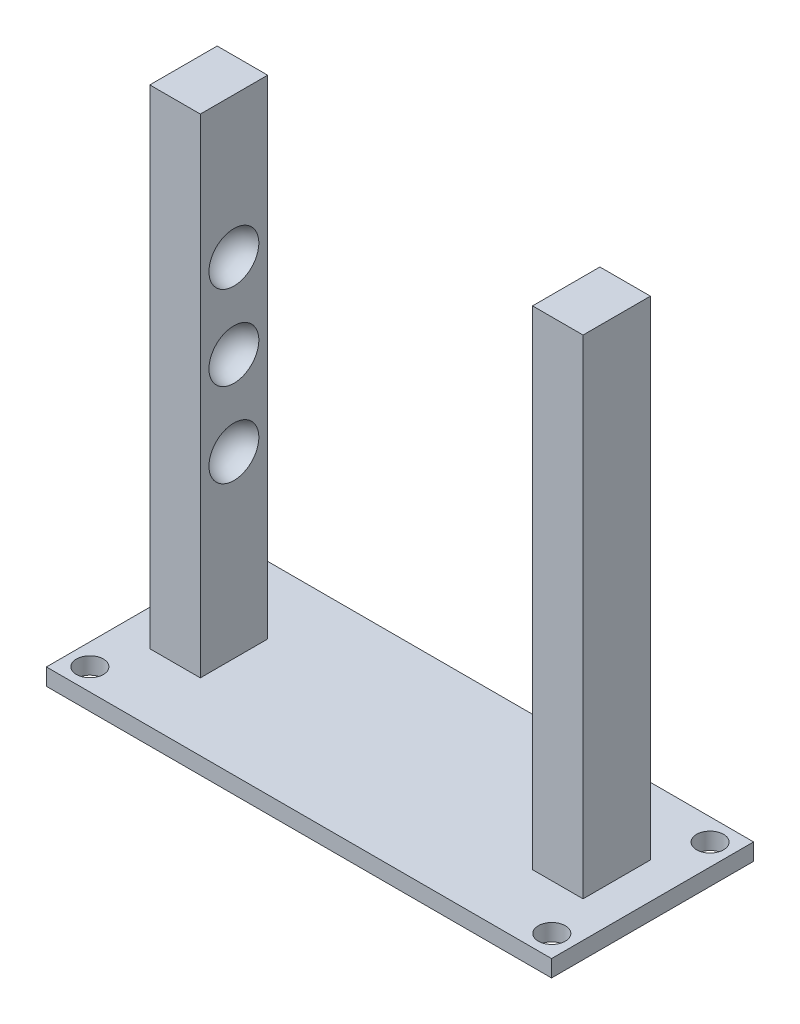
ISO-10303-21;
HEADER;
FILE_DESCRIPTION(('STEP AP214'),'2;1');
FILE_NAME('part.step','',(''),(''),'','','');
FILE_SCHEMA(('AUTOMOTIVE_DESIGN { 1 0 10303 214 1 1 1 1 }'));
ENDSEC;
DATA;
#1=APPLICATION_CONTEXT('core data for automotive mechanical design processes');
#2=APPLICATION_PROTOCOL_DEFINITION('international standard','automotive_design',2000,#1);
#3=PRODUCT_CONTEXT('',#1,'mechanical');
#4=PRODUCT('Part','Part','',(#3));
#5=PRODUCT_RELATED_PRODUCT_CATEGORY('part','',(#4));
#6=PRODUCT_DEFINITION_FORMATION('','',#4);
#7=PRODUCT_DEFINITION_CONTEXT('part definition',#1,'design');
#8=PRODUCT_DEFINITION('design','',#6,#7);
#9=PRODUCT_DEFINITION_SHAPE('','',#8);
#10=(LENGTH_UNIT() NAMED_UNIT(*) SI_UNIT(.MILLI.,.METRE.));
#11=(NAMED_UNIT(*) PLANE_ANGLE_UNIT() SI_UNIT($,.RADIAN.));
#12=(NAMED_UNIT(*) SI_UNIT($,.STERADIAN.) SOLID_ANGLE_UNIT());
#13=UNCERTAINTY_MEASURE_WITH_UNIT(LENGTH_MEASURE(1.E-05),#10,'distance_accuracy_value','');
#14=(GEOMETRIC_REPRESENTATION_CONTEXT(3) GLOBAL_UNCERTAINTY_ASSIGNED_CONTEXT((#13)) GLOBAL_UNIT_ASSIGNED_CONTEXT((#10,
#11,#12)) REPRESENTATION_CONTEXT('',''));
#15=CARTESIAN_POINT('',(0.,0.,0.));
#16=DIRECTION('',(0.,0.,1.));
#17=DIRECTION('',(1.,0.,0.));
#18=AXIS2_PLACEMENT_3D('',#15,#16,#17);
#19=CARTESIAN_POINT('',(0.,5.,0.));
#20=DIRECTION('',(0.,1.,0.));
#21=DIRECTION('',(0.,0.,1.));
#22=AXIS2_PLACEMENT_3D('',#19,#20,#21);
#23=PLANE('',#22);
#24=DIRECTION('',(0.,0.,-1.));
#25=VECTOR('',#24,1.);
#26=CARTESIAN_POINT('',(23.8497549812934,5.,0.));
#27=LINE('',#26,#25);
#28=CARTESIAN_POINT('',(23.8497549812934,5.,-0.572361891268997));
#29=VERTEX_POINT('',#28);
#30=CARTESIAN_POINT('',(23.8497549812934,5.,-20.572361891269));
#31=VERTEX_POINT('',#30);
#32=EDGE_CURVE('E140',#29,#31,#27,.T.);
#33=ORIENTED_EDGE('',*,*,#32,.F.);
#34=DIRECTION('',(1.,0.,0.));
#35=VECTOR('',#34,1.);
#36=CARTESIAN_POINT('',(0.,5.,-0.572361891268997));
#37=LINE('',#36,#35);
#38=CARTESIAN_POINT('',(8.84975498129335,5.,-0.572361891268997));
#39=VERTEX_POINT('',#38);
#40=EDGE_CURVE('E143',#39,#29,#37,.T.);
#41=ORIENTED_EDGE('',*,*,#40,.F.);
#42=DIRECTION('',(0.,0.,1.));
#43=VECTOR('',#42,1.);
#44=CARTESIAN_POINT('',(8.84975498129335,5.,0.));
#45=LINE('',#44,#43);
#46=CARTESIAN_POINT('',(8.84975498129335,5.,-20.572361891269));
#47=VERTEX_POINT('',#46);
#48=EDGE_CURVE('E67',#47,#39,#45,.T.);
#49=ORIENTED_EDGE('',*,*,#48,.F.);
#50=DIRECTION('',(-1.,0.,0.));
#51=VECTOR('',#50,1.);
#52=CARTESIAN_POINT('',(0.,5.,-20.572361891269));
#53=LINE('',#52,#51);
#54=EDGE_CURVE('E62',#31,#47,#53,.T.);
#55=ORIENTED_EDGE('',*,*,#54,.F.);
#56=EDGE_LOOP('',(#33,#41,#49,#55));
#57=FACE_BOUND('',#56,.T.);
#58=CARTESIAN_POINT('',(28.1101283683343,5.,-34.038808084481));
#59=DIRECTION('',(0.,-1.,0.));
#60=DIRECTION('',(0.,0.,1.));
#61=AXIS2_PLACEMENT_3D('',#58,#59,#60);
#62=CIRCLE('',#61,4.00000000000001);
#63=CARTESIAN_POINT('',(28.1101283683343,5.,-30.038808084481));
#64=VERTEX_POINT('',#63);
#65=EDGE_CURVE('E175',#64,#64,#62,.T.);
#66=ORIENTED_EDGE('',*,*,#65,.T.);
#67=EDGE_LOOP('',(#66));
#68=FACE_BOUND('',#67,.T.);
#69=CARTESIAN_POINT('',(28.1101283683343,5.,12.961191915519));
#70=DIRECTION('',(0.,1.,0.));
#71=DIRECTION('',(0.,0.,-1.));
#72=AXIS2_PLACEMENT_3D('',#69,#70,#71);
#73=CIRCLE('',#72,4.00000000000001);
#74=CARTESIAN_POINT('',(28.1101283683343,5.,8.96119191551903));
#75=VERTEX_POINT('',#74);
#76=EDGE_CURVE('E181',#75,#75,#73,.T.);
#77=ORIENTED_EDGE('',*,*,#76,.F.);
#78=EDGE_LOOP('',(#77));
#79=FACE_BOUND('',#78,.T.);
#80=CARTESIAN_POINT('',(-109.062885818753,5.,12.961191915519));
#81=DIRECTION('',(0.,-1.,0.));
#82=DIRECTION('',(0.,0.,-1.));
#83=AXIS2_PLACEMENT_3D('',#80,#81,#82);
#84=CIRCLE('',#83,4.00000000000001);
#85=CARTESIAN_POINT('',(-109.062885818753,5.,8.96119191551903));
#86=VERTEX_POINT('',#85);
#87=EDGE_CURVE('E187',#86,#86,#84,.T.);
#88=ORIENTED_EDGE('',*,*,#87,.T.);
#89=EDGE_LOOP('',(#88));
#90=FACE_BOUND('',#89,.T.);
#91=CARTESIAN_POINT('',(-109.062885818753,5.,-34.038808084481));
#92=DIRECTION('',(0.,1.,0.));
#93=DIRECTION('',(0.,0.,1.));
#94=AXIS2_PLACEMENT_3D('',#91,#92,#93);
#95=CIRCLE('',#94,4.00000000000001);
#96=CARTESIAN_POINT('',(-109.062885818753,5.,-30.038808084481));
#97=VERTEX_POINT('',#96);
#98=EDGE_CURVE('E193',#97,#97,#95,.T.);
#99=ORIENTED_EDGE('',*,*,#98,.F.);
#100=EDGE_LOOP('',(#99));
#101=FACE_BOUND('',#100,.T.);
#102=DIRECTION('',(0.,0.,1.));
#103=VECTOR('',#102,1.);
#104=CARTESIAN_POINT('',(-115.476378725209,5.,-40.538808084481));
#105=LINE('',#104,#103);
#106=CARTESIAN_POINT('',(-115.476378725209,5.,-40.538808084481));
#107=VERTEX_POINT('',#106);
#108=CARTESIAN_POINT('',(-115.476378725209,5.,19.461191915519));
#109=VERTEX_POINT('',#108);
#110=EDGE_CURVE('E233',#107,#109,#105,.T.);
#111=ORIENTED_EDGE('',*,*,#110,.T.);
#112=DIRECTION('',(1.,0.,0.));
#113=VECTOR('',#112,1.);
#114=CARTESIAN_POINT('',(-115.476378725209,5.,19.461191915519));
#115=LINE('',#114,#113);
#116=CARTESIAN_POINT('',(34.5236212747906,5.,19.461191915519));
#117=VERTEX_POINT('',#116);
#118=EDGE_CURVE('E236',#109,#117,#115,.T.);
#119=ORIENTED_EDGE('',*,*,#118,.T.);
#120=DIRECTION('',(0.,0.,-1.));
#121=VECTOR('',#120,1.);
#122=CARTESIAN_POINT('',(34.5236212747906,5.,-40.538808084481));
#123=LINE('',#122,#121);
#124=CARTESIAN_POINT('',(34.5236212747906,5.,-40.538808084481));
#125=VERTEX_POINT('',#124);
#126=EDGE_CURVE('E239',#117,#125,#123,.T.);
#127=ORIENTED_EDGE('',*,*,#126,.T.);
#128=DIRECTION('',(-1.,0.,0.));
#129=VECTOR('',#128,1.);
#130=CARTESIAN_POINT('',(-115.476378725209,5.,-40.538808084481));
#131=LINE('',#130,#129);
#132=EDGE_CURVE('E241',#125,#107,#131,.T.);
#133=ORIENTED_EDGE('',*,*,#132,.T.);
#134=EDGE_LOOP('',(#111,#119,#127,#133));
#135=FACE_BOUND('',#134,.T.);
#136=DIRECTION('',(-1.,0.,0.));
#137=VECTOR('',#136,1.);
#138=CARTESIAN_POINT('',(0.,5.,-0.572361891268997));
#139=LINE('',#138,#137);
#140=CARTESIAN_POINT('',(-89.8025124317122,5.,-0.572361891268997));
#141=VERTEX_POINT('',#140);
#142=CARTESIAN_POINT('',(-104.802512431712,5.,-0.572361891268997));
#143=VERTEX_POINT('',#142);
#144=EDGE_CURVE('E226',#141,#143,#139,.T.);
#145=ORIENTED_EDGE('',*,*,#144,.T.);
#146=DIRECTION('',(0.,0.,-1.));
#147=VECTOR('',#146,1.);
#148=CARTESIAN_POINT('',(-104.802512431712,5.,0.));
#149=LINE('',#148,#147);
#150=CARTESIAN_POINT('',(-104.802512431712,5.,-20.572361891269));
#151=VERTEX_POINT('',#150);
#152=EDGE_CURVE('E229',#143,#151,#149,.T.);
#153=ORIENTED_EDGE('',*,*,#152,.T.);
#154=DIRECTION('',(1.,0.,0.));
#155=VECTOR('',#154,1.);
#156=CARTESIAN_POINT('',(0.,5.,-20.572361891269));
#157=LINE('',#156,#155);
#158=CARTESIAN_POINT('',(-89.8025124317122,5.,-20.572361891269));
#159=VERTEX_POINT('',#158);
#160=EDGE_CURVE('E220',#151,#159,#157,.T.);
#161=ORIENTED_EDGE('',*,*,#160,.T.);
#162=DIRECTION('',(0.,0.,1.));
#163=VECTOR('',#162,1.);
#164=CARTESIAN_POINT('',(-89.8025124317122,5.,0.));
#165=LINE('',#164,#163);
#166=EDGE_CURVE('E223',#159,#141,#165,.T.);
#167=ORIENTED_EDGE('',*,*,#166,.T.);
#168=EDGE_LOOP('',(#145,#153,#161,#167));
#169=FACE_BOUND('',#168,.T.);
#170=ADVANCED_FACE('F45',(#57,#68,#79,#90,#101,#135,#169),#23,.T.);
#171=CARTESIAN_POINT('',(-115.476378725209,5.,-40.538808084481));
#172=DIRECTION('',(1.,0.,0.));
#173=DIRECTION('',(0.,0.,-1.));
#174=AXIS2_PLACEMENT_3D('',#171,#172,#173);
#175=PLANE('',#174);
#176=DIRECTION('',(0.,0.,1.));
#177=VECTOR('',#176,1.);
#178=CARTESIAN_POINT('',(-115.476378725209,0.,-40.538808084481));
#179=LINE('',#178,#177);
#180=CARTESIAN_POINT('',(-115.476378725209,0.,-40.538808084481));
#181=VERTEX_POINT('',#180);
#182=CARTESIAN_POINT('',(-115.476378725209,0.,19.461191915519));
#183=VERTEX_POINT('',#182);
#184=EDGE_CURVE('E232',#181,#183,#179,.T.);
#185=ORIENTED_EDGE('',*,*,#184,.T.);
#186=DIRECTION('',(0.,-1.,0.));
#187=VECTOR('',#186,1.);
#188=CARTESIAN_POINT('',(-115.476378725209,5.,19.461191915519));
#189=LINE('',#188,#187);
#190=EDGE_CURVE('E11',#109,#183,#189,.T.);
#191=ORIENTED_EDGE('',*,*,#190,.F.);
#192=ORIENTED_EDGE('',*,*,#110,.F.);
#193=DIRECTION('',(0.,-1.,0.));
#194=VECTOR('',#193,1.);
#195=CARTESIAN_POINT('',(-115.476378725209,5.,-40.538808084481));
#196=LINE('',#195,#194);
#197=EDGE_CURVE('E243',#107,#181,#196,.T.);
#198=ORIENTED_EDGE('',*,*,#197,.T.);
#199=EDGE_LOOP('',(#185,#191,#192,#198));
#200=FACE_BOUND('',#199,.T.);
#201=ADVANCED_FACE('F47',(#200),#175,.F.);
#202=CARTESIAN_POINT('',(-115.476378725209,5.,19.461191915519));
#203=DIRECTION('',(0.,0.,-1.));
#204=DIRECTION('',(-1.,0.,0.));
#205=AXIS2_PLACEMENT_3D('',#202,#203,#204);
#206=PLANE('',#205);
#207=DIRECTION('',(1.,0.,0.));
#208=VECTOR('',#207,1.);
#209=CARTESIAN_POINT('',(-115.476378725209,0.,19.461191915519));
#210=LINE('',#209,#208);
#211=CARTESIAN_POINT('',(34.5236212747906,0.,19.461191915519));
#212=VERTEX_POINT('',#211);
#213=EDGE_CURVE('E246',#183,#212,#210,.T.);
#214=ORIENTED_EDGE('',*,*,#213,.T.);
#215=DIRECTION('',(0.,-1.,0.));
#216=VECTOR('',#215,1.);
#217=CARTESIAN_POINT('',(34.5236212747906,5.,19.461191915519));
#218=LINE('',#217,#216);
#219=EDGE_CURVE('E54',#117,#212,#218,.T.);
#220=ORIENTED_EDGE('',*,*,#219,.F.);
#221=ORIENTED_EDGE('',*,*,#118,.F.);
#222=ORIENTED_EDGE('',*,*,#190,.T.);
#223=EDGE_LOOP('',(#214,#220,#221,#222));
#224=FACE_BOUND('',#223,.T.);
#225=ADVANCED_FACE('F342',(#224),#206,.F.);
#226=CARTESIAN_POINT('',(34.5236212747906,5.,-40.538808084481));
#227=DIRECTION('',(-1.,0.,0.));
#228=DIRECTION('',(0.,0.,1.));
#229=AXIS2_PLACEMENT_3D('',#226,#227,#228);
#230=PLANE('',#229);
#231=DIRECTION('',(0.,0.,-1.));
#232=VECTOR('',#231,1.);
#233=CARTESIAN_POINT('',(34.5236212747906,0.,-40.538808084481));
#234=LINE('',#233,#232);
#235=CARTESIAN_POINT('',(34.5236212747906,0.,-40.538808084481));
#236=VERTEX_POINT('',#235);
#237=EDGE_CURVE('E248',#212,#236,#234,.T.);
#238=ORIENTED_EDGE('',*,*,#237,.T.);
#239=DIRECTION('',(0.,-1.,0.));
#240=VECTOR('',#239,1.);
#241=CARTESIAN_POINT('',(34.5236212747906,5.,-40.538808084481));
#242=LINE('',#241,#240);
#243=EDGE_CURVE('E253',#125,#236,#242,.T.);
#244=ORIENTED_EDGE('',*,*,#243,.F.);
#245=ORIENTED_EDGE('',*,*,#126,.F.);
#246=ORIENTED_EDGE('',*,*,#219,.T.);
#247=EDGE_LOOP('',(#238,#244,#245,#246));
#248=FACE_BOUND('',#247,.T.);
#249=ADVANCED_FACE('F339',(#248),#230,.F.);
#250=CARTESIAN_POINT('',(-115.476378725209,5.,-40.538808084481));
#251=DIRECTION('',(0.,0.,1.));
#252=DIRECTION('',(1.,0.,0.));
#253=AXIS2_PLACEMENT_3D('',#250,#251,#252);
#254=PLANE('',#253);
#255=DIRECTION('',(-1.,0.,0.));
#256=VECTOR('',#255,1.);
#257=CARTESIAN_POINT('',(-115.476378725209,0.,-40.538808084481));
#258=LINE('',#257,#256);
#259=EDGE_CURVE('E237',#236,#181,#258,.T.);
#260=ORIENTED_EDGE('',*,*,#259,.T.);
#261=ORIENTED_EDGE('',*,*,#197,.F.);
#262=ORIENTED_EDGE('',*,*,#132,.F.);
#263=ORIENTED_EDGE('',*,*,#243,.T.);
#264=EDGE_LOOP('',(#260,#261,#262,#263));
#265=FACE_BOUND('',#264,.T.);
#266=ADVANCED_FACE('F335',(#265),#254,.F.);
#267=CARTESIAN_POINT('',(0.,0.,0.));
#268=DIRECTION('',(0.,1.,0.));
#269=DIRECTION('',(0.,0.,1.));
#270=AXIS2_PLACEMENT_3D('',#267,#268,#269);
#271=PLANE('',#270);
#272=CARTESIAN_POINT('',(28.1101283683343,0.,-34.038808084481));
#273=DIRECTION('',(0.,-1.,0.));
#274=DIRECTION('',(0.,0.,1.));
#275=AXIS2_PLACEMENT_3D('',#272,#273,#274);
#276=CIRCLE('',#275,4.00000000000001);
#277=CARTESIAN_POINT('',(28.1101283683343,0.,-30.038808084481));
#278=VERTEX_POINT('',#277);
#279=EDGE_CURVE('E174',#278,#278,#276,.T.);
#280=ORIENTED_EDGE('',*,*,#279,.F.);
#281=EDGE_LOOP('',(#280));
#282=FACE_BOUND('',#281,.T.);
#283=CARTESIAN_POINT('',(28.1101283683343,0.,12.961191915519));
#284=DIRECTION('',(0.,1.,0.));
#285=DIRECTION('',(0.,0.,-1.));
#286=AXIS2_PLACEMENT_3D('',#283,#284,#285);
#287=CIRCLE('',#286,4.00000000000001);
#288=CARTESIAN_POINT('',(28.1101283683343,0.,8.96119191551903));
#289=VERTEX_POINT('',#288);
#290=EDGE_CURVE('E178',#289,#289,#287,.T.);
#291=ORIENTED_EDGE('',*,*,#290,.T.);
#292=EDGE_LOOP('',(#291));
#293=FACE_BOUND('',#292,.T.);
#294=CARTESIAN_POINT('',(-109.062885818753,0.,12.961191915519));
#295=DIRECTION('',(0.,-1.,0.));
#296=DIRECTION('',(0.,0.,-1.));
#297=AXIS2_PLACEMENT_3D('',#294,#295,#296);
#298=CIRCLE('',#297,4.00000000000001);
#299=CARTESIAN_POINT('',(-109.062885818753,0.,8.96119191551903));
#300=VERTEX_POINT('',#299);
#301=EDGE_CURVE('E184',#300,#300,#298,.T.);
#302=ORIENTED_EDGE('',*,*,#301,.F.);
#303=EDGE_LOOP('',(#302));
#304=FACE_BOUND('',#303,.T.);
#305=CARTESIAN_POINT('',(-109.062885818753,0.,-34.038808084481));
#306=DIRECTION('',(0.,1.,0.));
#307=DIRECTION('',(0.,0.,1.));
#308=AXIS2_PLACEMENT_3D('',#305,#306,#307);
#309=CIRCLE('',#308,4.00000000000001);
#310=CARTESIAN_POINT('',(-109.062885818753,0.,-30.038808084481));
#311=VERTEX_POINT('',#310);
#312=EDGE_CURVE('E190',#311,#311,#309,.T.);
#313=ORIENTED_EDGE('',*,*,#312,.T.);
#314=EDGE_LOOP('',(#313));
#315=FACE_BOUND('',#314,.T.);
#316=ORIENTED_EDGE('',*,*,#184,.F.);
#317=ORIENTED_EDGE('',*,*,#259,.F.);
#318=ORIENTED_EDGE('',*,*,#237,.F.);
#319=ORIENTED_EDGE('',*,*,#213,.F.);
#320=EDGE_LOOP('',(#316,#317,#318,#319));
#321=FACE_BOUND('',#320,.T.);
#322=ADVANCED_FACE('F331',(#282,#293,#304,#315,#321),#271,.F.);
#323=CARTESIAN_POINT('',(-104.802512431712,150.,-20.572361891269));
#324=DIRECTION('',(1.,0.,0.));
#325=DIRECTION('',(0.,0.,-1.));
#326=AXIS2_PLACEMENT_3D('',#323,#324,#325);
#327=PLANE('',#326);
#328=ORIENTED_EDGE('',*,*,#152,.F.);
#329=DIRECTION('',(0.,-1.,0.));
#330=VECTOR('',#329,1.);
#331=CARTESIAN_POINT('',(-104.802512431712,150.,-0.572361891268997));
#332=LINE('',#331,#330);
#333=CARTESIAN_POINT('',(-104.802512431712,150.,-0.572361891268997));
#334=VERTEX_POINT('',#333);
#335=EDGE_CURVE('E217',#334,#143,#332,.T.);
#336=ORIENTED_EDGE('',*,*,#335,.F.);
#337=DIRECTION('',(0.,0.,1.));
#338=VECTOR('',#337,1.);
#339=CARTESIAN_POINT('',(-104.802512431712,150.,-20.572361891269));
#340=LINE('',#339,#338);
#341=CARTESIAN_POINT('',(-104.802512431712,150.,-20.572361891269));
#342=VERTEX_POINT('',#341);
#343=EDGE_CURVE('E199',#342,#334,#340,.T.);
#344=ORIENTED_EDGE('',*,*,#343,.F.);
#345=DIRECTION('',(0.,-1.,0.));
#346=VECTOR('',#345,1.);
#347=CARTESIAN_POINT('',(-104.802512431712,150.,-20.572361891269));
#348=LINE('',#347,#346);
#349=EDGE_CURVE('E209',#342,#151,#348,.T.);
#350=ORIENTED_EDGE('',*,*,#349,.T.);
#351=EDGE_LOOP('',(#328,#336,#344,#350));
#352=FACE_BOUND('',#351,.T.);
#353=ADVANCED_FACE('F313',(#352),#327,.F.);
#354=CARTESIAN_POINT('',(-104.802512431712,150.,-0.572361891268997));
#355=DIRECTION('',(0.,0.,-1.));
#356=DIRECTION('',(-1.,0.,0.));
#357=AXIS2_PLACEMENT_3D('',#354,#355,#356);
#358=PLANE('',#357);
#359=ORIENTED_EDGE('',*,*,#144,.F.);
#360=DIRECTION('',(0.,-1.,0.));
#361=VECTOR('',#360,1.);
#362=CARTESIAN_POINT('',(-89.8025124317122,150.,-0.572361891268997));
#363=LINE('',#362,#361);
#364=CARTESIAN_POINT('',(-89.8025124317122,150.,-0.572361891268997));
#365=VERTEX_POINT('',#364);
#366=EDGE_CURVE('E214',#365,#141,#363,.T.);
#367=ORIENTED_EDGE('',*,*,#366,.F.);
#368=DIRECTION('',(1.,0.,0.));
#369=VECTOR('',#368,1.);
#370=CARTESIAN_POINT('',(-104.802512431712,150.,-0.572361891268997));
#371=LINE('',#370,#369);
#372=EDGE_CURVE('E202',#334,#365,#371,.T.);
#373=ORIENTED_EDGE('',*,*,#372,.F.);
#374=ORIENTED_EDGE('',*,*,#335,.T.);
#375=EDGE_LOOP('',(#359,#367,#373,#374));
#376=FACE_BOUND('',#375,.T.);
#377=ADVANCED_FACE('F301',(#376),#358,.F.);
#378=CARTESIAN_POINT('',(-89.8025124317122,150.,-20.572361891269));
#379=DIRECTION('',(-1.,0.,0.));
#380=DIRECTION('',(0.,0.,1.));
#381=AXIS2_PLACEMENT_3D('',#378,#379,#380);
#382=PLANE('',#381);
#383=CARTESIAN_POINT('',(-89.8025124317122,108.174013099664,-10.538808084481));
#384=DIRECTION('',(-1.,0.,0.));
#385=DIRECTION('',(0.,0.,1.));
#386=AXIS2_PLACEMENT_3D('',#383,#384,#385);
#387=CIRCLE('',#386,7.40217386064408);
#388=CARTESIAN_POINT('',(-89.8025124317122,108.174013099664,-3.1366342238369));
#389=VERTEX_POINT('',#388);
#390=EDGE_CURVE('E196',#389,#389,#387,.T.);
#391=ORIENTED_EDGE('',*,*,#390,.T.);
#392=EDGE_LOOP('',(#391));
#393=FACE_BOUND('',#392,.T.);
#394=CARTESIAN_POINT('',(-89.8025124317122,58.1740130996637,-10.538808084481));
#395=DIRECTION('',(-1.,0.,0.));
#396=DIRECTION('',(0.,0.,1.));
#397=AXIS2_PLACEMENT_3D('',#394,#395,#396);
#398=CIRCLE('',#397,7.40217386064408);
#399=CARTESIAN_POINT('',(-89.8025124317122,58.1740130996637,-3.1366342238369));
#400=VERTEX_POINT('',#399);
#401=EDGE_CURVE('E260',#400,#400,#398,.T.);
#402=ORIENTED_EDGE('',*,*,#401,.T.);
#403=EDGE_LOOP('',(#402));
#404=FACE_BOUND('',#403,.T.);
#405=CARTESIAN_POINT('',(-89.8025124317122,83.1740130996637,-10.538808084481));
#406=DIRECTION('',(-1.,0.,0.));
#407=DIRECTION('',(0.,0.,1.));
#408=AXIS2_PLACEMENT_3D('',#405,#406,#407);
#409=CIRCLE('',#408,7.40217386064408);
#410=CARTESIAN_POINT('',(-89.8025124317122,83.1740130996637,-3.1366342238369));
#411=VERTEX_POINT('',#410);
#412=EDGE_CURVE('E203',#411,#411,#409,.T.);
#413=ORIENTED_EDGE('',*,*,#412,.T.);
#414=EDGE_LOOP('',(#413));
#415=FACE_BOUND('',#414,.T.);
#416=ORIENTED_EDGE('',*,*,#166,.F.);
#417=DIRECTION('',(0.,-1.,0.));
#418=VECTOR('',#417,1.);
#419=CARTESIAN_POINT('',(-89.8025124317122,150.,-20.572361891269));
#420=LINE('',#419,#418);
#421=CARTESIAN_POINT('',(-89.8025124317122,150.,-20.572361891269));
#422=VERTEX_POINT('',#421);
#423=EDGE_CURVE('E212',#422,#159,#420,.T.);
#424=ORIENTED_EDGE('',*,*,#423,.F.);
#425=DIRECTION('',(0.,0.,-1.));
#426=VECTOR('',#425,1.);
#427=CARTESIAN_POINT('',(-89.8025124317122,150.,-20.572361891269));
#428=LINE('',#427,#426);
#429=EDGE_CURVE('E205',#365,#422,#428,.T.);
#430=ORIENTED_EDGE('',*,*,#429,.F.);
#431=ORIENTED_EDGE('',*,*,#366,.T.);
#432=EDGE_LOOP('',(#416,#424,#430,#431));
#433=FACE_BOUND('',#432,.T.);
#434=ADVANCED_FACE('F305',(#393,#404,#415,#433),#382,.F.);
#435=CARTESIAN_POINT('',(-104.802512431712,150.,-20.572361891269));
#436=DIRECTION('',(0.,0.,1.));
#437=DIRECTION('',(1.,0.,0.));
#438=AXIS2_PLACEMENT_3D('',#435,#436,#437);
#439=PLANE('',#438);
#440=ORIENTED_EDGE('',*,*,#160,.F.);
#441=ORIENTED_EDGE('',*,*,#349,.F.);
#442=DIRECTION('',(-1.,0.,0.));
#443=VECTOR('',#442,1.);
#444=CARTESIAN_POINT('',(-104.802512431712,150.,-20.572361891269));
#445=LINE('',#444,#443);
#446=EDGE_CURVE('E207',#422,#342,#445,.T.);
#447=ORIENTED_EDGE('',*,*,#446,.F.);
#448=ORIENTED_EDGE('',*,*,#423,.T.);
#449=EDGE_LOOP('',(#440,#441,#447,#448));
#450=FACE_BOUND('',#449,.T.);
#451=ADVANCED_FACE('F315',(#450),#439,.F.);
#452=CARTESIAN_POINT('',(0.,150.,0.));
#453=DIRECTION('',(0.,1.,0.));
#454=DIRECTION('',(0.,0.,1.));
#455=AXIS2_PLACEMENT_3D('',#452,#453,#454);
#456=PLANE('',#455);
#457=ORIENTED_EDGE('',*,*,#343,.T.);
#458=ORIENTED_EDGE('',*,*,#372,.T.);
#459=ORIENTED_EDGE('',*,*,#429,.T.);
#460=ORIENTED_EDGE('',*,*,#446,.T.);
#461=EDGE_LOOP('',(#457,#458,#459,#460));
#462=FACE_BOUND('',#461,.T.);
#463=ADVANCED_FACE('F309',(#462),#456,.T.);
#464=CARTESIAN_POINT('',(-89.8025124317122,83.1740130996637,-10.538808084481));
#465=DIRECTION('',(0.,1.,0.));
#466=DIRECTION('',(1.,0.,0.));
#467=AXIS2_PLACEMENT_3D('',#464,#465,#466);
#468=SPHERICAL_SURFACE('',#467,7.40217386064408);
#469=CARTESIAN_POINT('',(-89.8025124317122,83.1740130996637,-10.538808084481));
#470=DIRECTION('',(-1.,0.,0.));
#471=DIRECTION('',(0.,0.,1.));
#472=AXIS2_PLACEMENT_3D('',#469,#470,#471);
#473=SPHERICAL_SURFACE('',#472,7.40217386064408);
#474=ORIENTED_EDGE('',*,*,#412,.F.);
#475=EDGE_LOOP('',(#474));
#476=FACE_BOUND('',#475,.T.);
#477=ADVANCED_FACE('F322',(#476),#473,.F.);
#478=CARTESIAN_POINT('',(-89.8025124317122,58.1740130996637,-10.538808084481));
#479=DIRECTION('',(0.,1.,0.));
#480=DIRECTION('',(1.,0.,0.));
#481=AXIS2_PLACEMENT_3D('',#478,#479,#480);
#482=SPHERICAL_SURFACE('',#481,7.40217386064408);
#483=CARTESIAN_POINT('',(-89.8025124317122,58.1740130996637,-10.538808084481));
#484=DIRECTION('',(-1.,0.,0.));
#485=DIRECTION('',(0.,0.,1.));
#486=AXIS2_PLACEMENT_3D('',#483,#484,#485);
#487=SPHERICAL_SURFACE('',#486,7.40217386064408);
#488=ORIENTED_EDGE('',*,*,#401,.F.);
#489=EDGE_LOOP('',(#488));
#490=FACE_BOUND('',#489,.T.);
#491=ADVANCED_FACE('F428',(#490),#487,.F.);
#492=CARTESIAN_POINT('',(-89.8025124317122,108.174013099664,-10.538808084481));
#493=DIRECTION('',(0.,1.,0.));
#494=DIRECTION('',(1.,0.,0.));
#495=AXIS2_PLACEMENT_3D('',#492,#493,#494);
#496=SPHERICAL_SURFACE('',#495,7.40217386064408);
#497=CARTESIAN_POINT('',(-89.8025124317122,108.174013099664,-10.538808084481));
#498=DIRECTION('',(-1.,0.,0.));
#499=DIRECTION('',(0.,0.,1.));
#500=AXIS2_PLACEMENT_3D('',#497,#498,#499);
#501=SPHERICAL_SURFACE('',#500,7.40217386064408);
#502=ORIENTED_EDGE('',*,*,#390,.F.);
#503=EDGE_LOOP('',(#502));
#504=FACE_BOUND('',#503,.T.);
#505=ADVANCED_FACE('F436',(#504),#501,.F.);
#506=CARTESIAN_POINT('',(-109.062885818753,5.,-34.038808084481));
#507=DIRECTION('',(0.,-1.,0.));
#508=DIRECTION('',(0.,0.,-1.));
#509=AXIS2_PLACEMENT_3D('',#506,#507,#508);
#510=CYLINDRICAL_SURFACE('',#509,4.00000000000001);
#511=ORIENTED_EDGE('',*,*,#98,.T.);
#512=EDGE_LOOP('',(#511));
#513=FACE_BOUND('',#512,.T.);
#514=ORIENTED_EDGE('',*,*,#312,.F.);
#515=EDGE_LOOP('',(#514));
#516=FACE_BOUND('',#515,.T.);
#517=ADVANCED_FACE('F446',(#513,#516),#510,.F.);
#518=CARTESIAN_POINT('',(-109.062885818753,5.,12.961191915519));
#519=DIRECTION('',(0.,-1.,0.));
#520=DIRECTION('',(0.,0.,-1.));
#521=AXIS2_PLACEMENT_3D('',#518,#519,#520);
#522=CYLINDRICAL_SURFACE('',#521,4.00000000000001);
#523=ORIENTED_EDGE('',*,*,#87,.F.);
#524=EDGE_LOOP('',(#523));
#525=FACE_BOUND('',#524,.T.);
#526=ORIENTED_EDGE('',*,*,#301,.T.);
#527=EDGE_LOOP('',(#526));
#528=FACE_BOUND('',#527,.T.);
#529=ADVANCED_FACE('F456',(#525,#528),#522,.F.);
#530=CARTESIAN_POINT('',(28.1101283683343,5.,12.961191915519));
#531=DIRECTION('',(0.,-1.,0.));
#532=DIRECTION('',(0.,0.,-1.));
#533=AXIS2_PLACEMENT_3D('',#530,#531,#532);
#534=CYLINDRICAL_SURFACE('',#533,4.00000000000001);
#535=ORIENTED_EDGE('',*,*,#76,.T.);
#536=EDGE_LOOP('',(#535));
#537=FACE_BOUND('',#536,.T.);
#538=ORIENTED_EDGE('',*,*,#290,.F.);
#539=EDGE_LOOP('',(#538));
#540=FACE_BOUND('',#539,.T.);
#541=ADVANCED_FACE('F466',(#537,#540),#534,.F.);
#542=CARTESIAN_POINT('',(28.1101283683343,5.,-34.038808084481));
#543=DIRECTION('',(0.,-1.,0.));
#544=DIRECTION('',(0.,0.,-1.));
#545=AXIS2_PLACEMENT_3D('',#542,#543,#544);
#546=CYLINDRICAL_SURFACE('',#545,4.00000000000001);
#547=ORIENTED_EDGE('',*,*,#65,.F.);
#548=EDGE_LOOP('',(#547));
#549=FACE_BOUND('',#548,.T.);
#550=ORIENTED_EDGE('',*,*,#279,.T.);
#551=EDGE_LOOP('',(#550));
#552=FACE_BOUND('',#551,.T.);
#553=ADVANCED_FACE('F476',(#549,#552),#546,.F.);
#554=CARTESIAN_POINT('',(23.8497549812934,150.,-20.572361891269));
#555=DIRECTION('',(1.,0.,0.));
#556=DIRECTION('',(0.,0.,-1.));
#557=AXIS2_PLACEMENT_3D('',#554,#555,#556);
#558=PLANE('',#557);
#559=DIRECTION('',(0.,-1.,0.));
#560=VECTOR('',#559,1.);
#561=CARTESIAN_POINT('',(23.8497549812934,150.,-0.572361891268997));
#562=LINE('',#561,#560);
#563=CARTESIAN_POINT('',(23.8497549812934,150.,-0.572361891268997));
#564=VERTEX_POINT('',#563);
#565=EDGE_CURVE('E163',#564,#29,#562,.T.);
#566=ORIENTED_EDGE('',*,*,#565,.T.);
#567=ORIENTED_EDGE('',*,*,#32,.T.);
#568=DIRECTION('',(0.,-1.,0.));
#569=VECTOR('',#568,1.);
#570=CARTESIAN_POINT('',(23.8497549812934,150.,-20.572361891269));
#571=LINE('',#570,#569);
#572=CARTESIAN_POINT('',(23.8497549812934,150.,-20.572361891269));
#573=VERTEX_POINT('',#572);
#574=EDGE_CURVE('E134',#573,#31,#571,.T.);
#575=ORIENTED_EDGE('',*,*,#574,.F.);
#576=DIRECTION('',(0.,0.,1.));
#577=VECTOR('',#576,1.);
#578=CARTESIAN_POINT('',(23.8497549812934,150.,-20.572361891269));
#579=LINE('',#578,#577);
#580=EDGE_CURVE('E138',#573,#564,#579,.T.);
#581=ORIENTED_EDGE('',*,*,#580,.T.);
#582=EDGE_LOOP('',(#566,#567,#575,#581));
#583=FACE_BOUND('',#582,.T.);
#584=ADVANCED_FACE('F137',(#583),#558,.T.);
#585=CARTESIAN_POINT('',(23.8497549812934,150.,-20.572361891269));
#586=DIRECTION('',(0.,0.,-1.));
#587=DIRECTION('',(-1.,0.,0.));
#588=AXIS2_PLACEMENT_3D('',#585,#586,#587);
#589=PLANE('',#588);
#590=ORIENTED_EDGE('',*,*,#574,.T.);
#591=ORIENTED_EDGE('',*,*,#54,.T.);
#592=DIRECTION('',(0.,-1.,0.));
#593=VECTOR('',#592,1.);
#594=CARTESIAN_POINT('',(8.84975498129335,150.,-20.572361891269));
#595=LINE('',#594,#593);
#596=CARTESIAN_POINT('',(8.84975498129335,150.,-20.572361891269));
#597=VERTEX_POINT('',#596);
#598=EDGE_CURVE('E144',#597,#47,#595,.T.);
#599=ORIENTED_EDGE('',*,*,#598,.F.);
#600=DIRECTION('',(1.,0.,0.));
#601=VECTOR('',#600,1.);
#602=CARTESIAN_POINT('',(23.8497549812934,150.,-20.572361891269));
#603=LINE('',#602,#601);
#604=EDGE_CURVE('E150',#597,#573,#603,.T.);
#605=ORIENTED_EDGE('',*,*,#604,.T.);
#606=EDGE_LOOP('',(#590,#591,#599,#605));
#607=FACE_BOUND('',#606,.T.);
#608=ADVANCED_FACE('F156',(#607),#589,.T.);
#609=CARTESIAN_POINT('',(8.84975498129335,150.,-20.572361891269));
#610=DIRECTION('',(-1.,0.,0.));
#611=DIRECTION('',(0.,0.,1.));
#612=AXIS2_PLACEMENT_3D('',#609,#610,#611);
#613=PLANE('',#612);
#614=CARTESIAN_POINT('',(8.84975498129335,108.174013099664,-10.538808084481));
#615=DIRECTION('',(-1.,0.,0.));
#616=DIRECTION('',(0.,0.,1.));
#617=AXIS2_PLACEMENT_3D('',#614,#615,#616);
#618=CIRCLE('',#617,7.40217386064408);
#619=CARTESIAN_POINT('',(8.84975498129335,108.174013099664,-3.1366342238369));
#620=VERTEX_POINT('',#619);
#621=EDGE_CURVE('E49',#620,#620,#618,.T.);
#622=ORIENTED_EDGE('',*,*,#621,.F.);
#623=EDGE_LOOP('',(#622));
#624=FACE_BOUND('',#623,.T.);
#625=CARTESIAN_POINT('',(8.84975498129335,58.1740130996637,-10.538808084481));
#626=DIRECTION('',(-1.,0.,0.));
#627=DIRECTION('',(0.,0.,1.));
#628=AXIS2_PLACEMENT_3D('',#625,#626,#627);
#629=CIRCLE('',#628,7.40217386064408);
#630=CARTESIAN_POINT('',(8.84975498129335,58.1740130996637,-3.1366342238369));
#631=VERTEX_POINT('',#630);
#632=EDGE_CURVE('E266',#631,#631,#629,.T.);
#633=ORIENTED_EDGE('',*,*,#632,.F.);
#634=EDGE_LOOP('',(#633));
#635=FACE_BOUND('',#634,.T.);
#636=CARTESIAN_POINT('',(8.84975498129335,83.1740130996637,-10.538808084481));
#637=DIRECTION('',(-1.,0.,0.));
#638=DIRECTION('',(0.,0.,1.));
#639=AXIS2_PLACEMENT_3D('',#636,#637,#638);
#640=CIRCLE('',#639,7.40217386064408);
#641=CARTESIAN_POINT('',(8.84975498129335,83.1740130996637,-3.1366342238369));
#642=VERTEX_POINT('',#641);
#643=EDGE_CURVE('E154',#642,#642,#640,.T.);
#644=ORIENTED_EDGE('',*,*,#643,.F.);
#645=EDGE_LOOP('',(#644));
#646=FACE_BOUND('',#645,.T.);
#647=ORIENTED_EDGE('',*,*,#598,.T.);
#648=ORIENTED_EDGE('',*,*,#48,.T.);
#649=DIRECTION('',(0.,-1.,0.));
#650=VECTOR('',#649,1.);
#651=CARTESIAN_POINT('',(8.84975498129335,150.,-0.572361891268997));
#652=LINE('',#651,#650);
#653=CARTESIAN_POINT('',(8.84975498129335,150.,-0.572361891268997));
#654=VERTEX_POINT('',#653);
#655=EDGE_CURVE('E165',#654,#39,#652,.T.);
#656=ORIENTED_EDGE('',*,*,#655,.F.);
#657=DIRECTION('',(0.,0.,-1.));
#658=VECTOR('',#657,1.);
#659=CARTESIAN_POINT('',(8.84975498129335,150.,-20.572361891269));
#660=LINE('',#659,#658);
#661=EDGE_CURVE('E158',#654,#597,#660,.T.);
#662=ORIENTED_EDGE('',*,*,#661,.T.);
#663=EDGE_LOOP('',(#647,#648,#656,#662));
#664=FACE_BOUND('',#663,.T.);
#665=ADVANCED_FACE('F275',(#624,#635,#646,#664),#613,.T.);
#666=CARTESIAN_POINT('',(23.8497549812934,150.,-0.572361891268997));
#667=DIRECTION('',(0.,0.,1.));
#668=DIRECTION('',(1.,0.,0.));
#669=AXIS2_PLACEMENT_3D('',#666,#667,#668);
#670=PLANE('',#669);
#671=ORIENTED_EDGE('',*,*,#655,.T.);
#672=ORIENTED_EDGE('',*,*,#40,.T.);
#673=ORIENTED_EDGE('',*,*,#565,.F.);
#674=DIRECTION('',(-1.,0.,0.));
#675=VECTOR('',#674,1.);
#676=CARTESIAN_POINT('',(23.8497549812934,150.,-0.572361891268997));
#677=LINE('',#676,#675);
#678=EDGE_CURVE('E153',#564,#654,#677,.T.);
#679=ORIENTED_EDGE('',*,*,#678,.T.);
#680=EDGE_LOOP('',(#671,#672,#673,#679));
#681=FACE_BOUND('',#680,.T.);
#682=ADVANCED_FACE('F278',(#681),#670,.T.);
#683=CARTESIAN_POINT('',(-80.9527574504189,150.,0.));
#684=DIRECTION('',(0.,1.,0.));
#685=DIRECTION('',(0.,0.,1.));
#686=AXIS2_PLACEMENT_3D('',#683,#684,#685);
#687=PLANE('',#686);
#688=ORIENTED_EDGE('',*,*,#580,.F.);
#689=ORIENTED_EDGE('',*,*,#604,.F.);
#690=ORIENTED_EDGE('',*,*,#661,.F.);
#691=ORIENTED_EDGE('',*,*,#678,.F.);
#692=EDGE_LOOP('',(#688,#689,#690,#691));
#693=FACE_BOUND('',#692,.T.);
#694=ADVANCED_FACE('F148',(#693),#687,.T.);
#695=CARTESIAN_POINT('',(8.84975498129335,83.1740130996637,-10.538808084481));
#696=DIRECTION('',(0.,1.,0.));
#697=DIRECTION('',(-1.,0.,0.));
#698=AXIS2_PLACEMENT_3D('',#695,#696,#697);
#699=SPHERICAL_SURFACE('',#698,7.40217386064408);
#700=CARTESIAN_POINT('',(8.84975498129335,83.1740130996637,-10.538808084481));
#701=DIRECTION('',(-1.,0.,0.));
#702=DIRECTION('',(0.,0.,1.));
#703=AXIS2_PLACEMENT_3D('',#700,#701,#702);
#704=SPHERICAL_SURFACE('',#703,7.40217386064408);
#705=ORIENTED_EDGE('',*,*,#643,.T.);
#706=EDGE_LOOP('',(#705));
#707=FACE_BOUND('',#706,.T.);
#708=ADVANCED_FACE('F526',(#707),#704,.F.);
#709=CARTESIAN_POINT('',(8.84975498129335,58.1740130996637,-10.538808084481));
#710=DIRECTION('',(0.,1.,0.));
#711=DIRECTION('',(-1.,0.,0.));
#712=AXIS2_PLACEMENT_3D('',#709,#710,#711);
#713=SPHERICAL_SURFACE('',#712,7.40217386064408);
#714=CARTESIAN_POINT('',(8.84975498129335,58.1740130996637,-10.538808084481));
#715=DIRECTION('',(-1.,0.,0.));
#716=DIRECTION('',(0.,0.,1.));
#717=AXIS2_PLACEMENT_3D('',#714,#715,#716);
#718=SPHERICAL_SURFACE('',#717,7.40217386064408);
#719=ORIENTED_EDGE('',*,*,#632,.T.);
#720=EDGE_LOOP('',(#719));
#721=FACE_BOUND('',#720,.T.);
#722=ADVANCED_FACE('F534',(#721),#718,.F.);
#723=CARTESIAN_POINT('',(8.84975498129335,108.174013099664,-10.538808084481));
#724=DIRECTION('',(0.,1.,0.));
#725=DIRECTION('',(-1.,0.,0.));
#726=AXIS2_PLACEMENT_3D('',#723,#724,#725);
#727=SPHERICAL_SURFACE('',#726,7.40217386064408);
#728=CARTESIAN_POINT('',(8.84975498129335,108.174013099664,-10.538808084481));
#729=DIRECTION('',(-1.,0.,0.));
#730=DIRECTION('',(0.,0.,1.));
#731=AXIS2_PLACEMENT_3D('',#728,#729,#730);
#732=SPHERICAL_SURFACE('',#731,7.40217386064408);
#733=ORIENTED_EDGE('',*,*,#621,.T.);
#734=EDGE_LOOP('',(#733));
#735=FACE_BOUND('',#734,.T.);
#736=ADVANCED_FACE('F273',(#735),#732,.F.);
#737=CLOSED_SHELL('',(#170,#201,#225,#249,#266,#322,#353,#377,#434,#451,#463,#477,#491,#505,
#517,#529,#541,#553,#584,#608,#665,#682,#694,#708,#722,#736));
#738=MANIFOLD_SOLID_BREP('B2',#737);
#739=ADVANCED_BREP_SHAPE_REPRESENTATION('',(#18,#738),#14);
#740=SHAPE_DEFINITION_REPRESENTATION(#9,#739);
ENDSEC;
END-ISO-10303-21;
